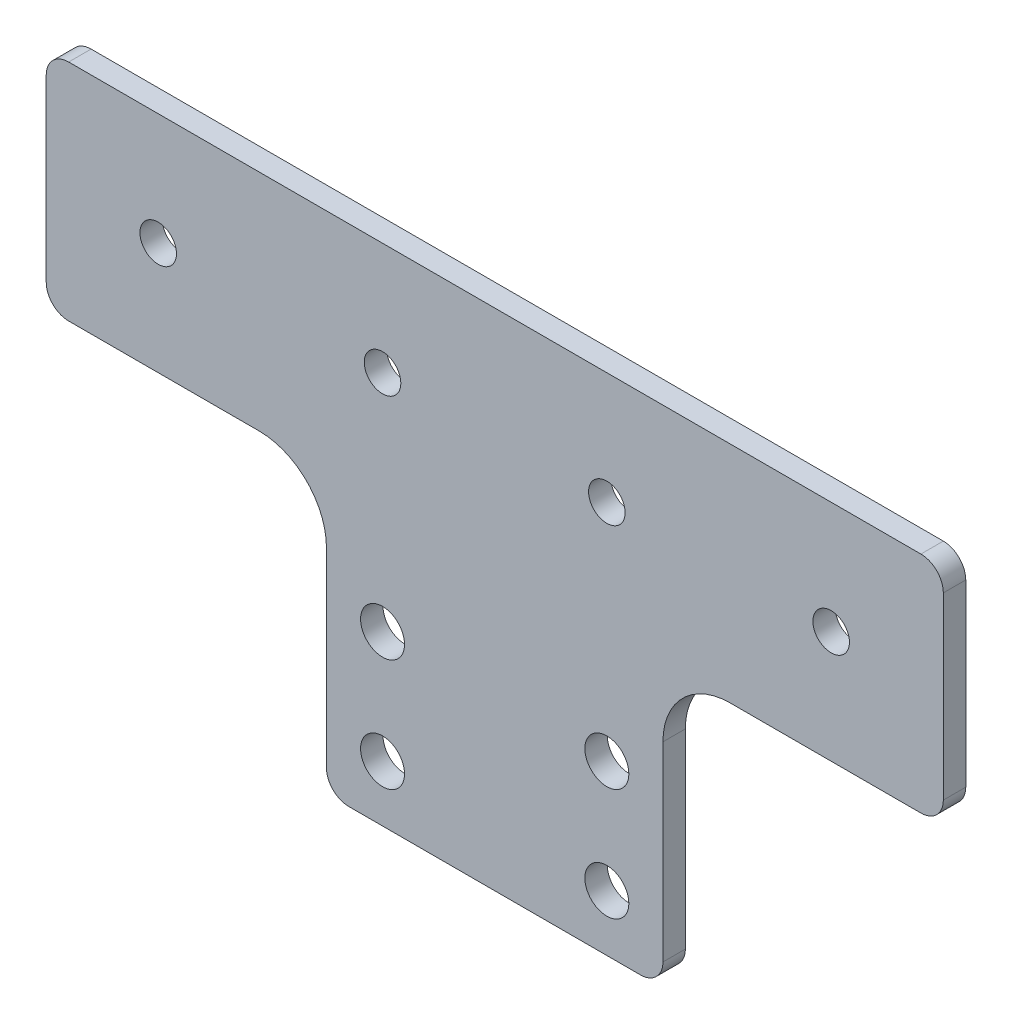
ISO-10303-21;
HEADER;
FILE_DESCRIPTION(('STEP AP214'),'2;1');
FILE_NAME('part.step','',(''),(''),'','','');
FILE_SCHEMA(('AUTOMOTIVE_DESIGN { 1 0 10303 214 1 1 1 1 }'));
ENDSEC;
DATA;
#1=APPLICATION_CONTEXT('core data for automotive mechanical design processes');
#2=APPLICATION_PROTOCOL_DEFINITION('international standard','automotive_design',2000,#1);
#3=PRODUCT_CONTEXT('',#1,'mechanical');
#4=PRODUCT('Part','Part','',(#3));
#5=PRODUCT_RELATED_PRODUCT_CATEGORY('part','',(#4));
#6=PRODUCT_DEFINITION_FORMATION('','',#4);
#7=PRODUCT_DEFINITION_CONTEXT('part definition',#1,'design');
#8=PRODUCT_DEFINITION('design','',#6,#7);
#9=PRODUCT_DEFINITION_SHAPE('','',#8);
#10=(LENGTH_UNIT() NAMED_UNIT(*) SI_UNIT(.MILLI.,.METRE.));
#11=(NAMED_UNIT(*) PLANE_ANGLE_UNIT() SI_UNIT($,.RADIAN.));
#12=(NAMED_UNIT(*) SI_UNIT($,.STERADIAN.) SOLID_ANGLE_UNIT());
#13=UNCERTAINTY_MEASURE_WITH_UNIT(LENGTH_MEASURE(1.E-05),#10,'distance_accuracy_value','');
#14=(GEOMETRIC_REPRESENTATION_CONTEXT(3) GLOBAL_UNCERTAINTY_ASSIGNED_CONTEXT((#13)) GLOBAL_UNIT_ASSIGNED_CONTEXT((#10,
#11,#12)) REPRESENTATION_CONTEXT('',''));
#15=CARTESIAN_POINT('',(0.,0.,0.));
#16=DIRECTION('',(0.,0.,1.));
#17=DIRECTION('',(1.,0.,0.));
#18=AXIS2_PLACEMENT_3D('',#15,#16,#17);
#19=CARTESIAN_POINT('',(29.21,-3.81,2.54));
#20=DIRECTION('',(0.,0.,1.));
#21=DIRECTION('',(1.,0.,0.));
#22=AXIS2_PLACEMENT_3D('',#19,#20,#21);
#23=PLANE('',#22);
#24=CARTESIAN_POINT('',(25.4,12.7000000000004,2.54));
#25=DIRECTION('',(0.,0.,1.));
#26=DIRECTION('',(1.,0.,0.));
#27=AXIS2_PLACEMENT_3D('',#24,#25,#26);
#28=CIRCLE('',#27,2.48920000000006);
#29=CARTESIAN_POINT('',(27.8892,12.7000000000004,2.54));
#30=VERTEX_POINT('',#29);
#31=EDGE_CURVE('E359',#30,#30,#28,.T.);
#32=ORIENTED_EDGE('',*,*,#31,.F.);
#33=EDGE_LOOP('',(#32));
#34=FACE_BOUND('',#33,.T.);
#35=CARTESIAN_POINT('',(0.,12.7,2.54));
#36=DIRECTION('',(0.,0.,1.));
#37=DIRECTION('',(1.,0.,0.));
#38=AXIS2_PLACEMENT_3D('',#35,#36,#37);
#39=CIRCLE('',#38,2.48920000000006);
#40=CARTESIAN_POINT('',(2.48920000000006,12.7,2.54));
#41=VERTEX_POINT('',#40);
#42=EDGE_CURVE('E371',#41,#41,#39,.T.);
#43=ORIENTED_EDGE('',*,*,#42,.F.);
#44=EDGE_LOOP('',(#43));
#45=FACE_BOUND('',#44,.T.);
#46=CARTESIAN_POINT('',(25.4,38.1000000000002,2.54));
#47=DIRECTION('',(0.,0.,1.));
#48=DIRECTION('',(1.,0.,0.));
#49=AXIS2_PLACEMENT_3D('',#46,#47,#48);
#50=CIRCLE('',#49,2.07010000000004);
#51=CARTESIAN_POINT('',(27.4701,38.1000000000002,2.54));
#52=VERTEX_POINT('',#51);
#53=EDGE_CURVE('E383',#52,#52,#50,.T.);
#54=ORIENTED_EDGE('',*,*,#53,.F.);
#55=EDGE_LOOP('',(#54));
#56=FACE_BOUND('',#55,.T.);
#57=CARTESIAN_POINT('',(-25.4,38.1000000000002,2.54));
#58=DIRECTION('',(0.,0.,1.));
#59=DIRECTION('',(1.,0.,0.));
#60=AXIS2_PLACEMENT_3D('',#57,#58,#59);
#61=CIRCLE('',#60,2.07010000000004);
#62=CARTESIAN_POINT('',(-23.3299,38.1000000000002,2.54));
#63=VERTEX_POINT('',#62);
#64=EDGE_CURVE('E182',#63,#63,#61,.T.);
#65=ORIENTED_EDGE('',*,*,#64,.F.);
#66=EDGE_LOOP('',(#65));
#67=FACE_BOUND('',#66,.T.);
#68=CARTESIAN_POINT('',(29.21,-3.81,2.54));
#69=DIRECTION('',(0.,0.,1.));
#70=DIRECTION('',(1.,0.,0.));
#71=AXIS2_PLACEMENT_3D('',#68,#69,#70);
#72=CIRCLE('',#71,2.54);
#73=CARTESIAN_POINT('',(29.21,-6.35,2.54));
#74=VERTEX_POINT('',#73);
#75=CARTESIAN_POINT('',(31.75,-3.81,2.54));
#76=VERTEX_POINT('',#75);
#77=EDGE_CURVE('E209',#74,#76,#72,.T.);
#78=ORIENTED_EDGE('',*,*,#77,.T.);
#79=DIRECTION('',(0.,1.,0.));
#80=VECTOR('',#79,1.);
#81=CARTESIAN_POINT('',(31.75,17.7800000000002,2.54));
#82=LINE('',#81,#80);
#83=CARTESIAN_POINT('',(31.75,17.7800000000002,2.54));
#84=VERTEX_POINT('',#83);
#85=EDGE_CURVE('E117',#76,#84,#82,.T.);
#86=ORIENTED_EDGE('',*,*,#85,.T.);
#87=CARTESIAN_POINT('',(39.37,17.7800000000002,2.54));
#88=DIRECTION('',(0.,0.,-1.));
#89=DIRECTION('',(1.,0.,0.));
#90=AXIS2_PLACEMENT_3D('',#87,#88,#89);
#91=CIRCLE('',#90,7.62);
#92=CARTESIAN_POINT('',(39.37,25.4000000000002,2.54));
#93=VERTEX_POINT('',#92);
#94=EDGE_CURVE('E248',#84,#93,#91,.T.);
#95=ORIENTED_EDGE('',*,*,#94,.T.);
#96=DIRECTION('',(1.,0.,0.));
#97=VECTOR('',#96,1.);
#98=CARTESIAN_POINT('',(39.37,25.4000000000002,2.54));
#99=LINE('',#98,#97);
#100=CARTESIAN_POINT('',(60.96,25.4000000000002,2.54));
#101=VERTEX_POINT('',#100);
#102=EDGE_CURVE('E267',#93,#101,#99,.T.);
#103=ORIENTED_EDGE('',*,*,#102,.T.);
#104=CARTESIAN_POINT('',(60.96,27.9400000000002,2.54));
#105=DIRECTION('',(0.,0.,1.));
#106=DIRECTION('',(1.,0.,0.));
#107=AXIS2_PLACEMENT_3D('',#104,#105,#106);
#108=CIRCLE('',#107,2.54);
#109=CARTESIAN_POINT('',(63.5,27.9400000000002,2.54));
#110=VERTEX_POINT('',#109);
#111=EDGE_CURVE('E264',#101,#110,#108,.T.);
#112=ORIENTED_EDGE('',*,*,#111,.T.);
#113=DIRECTION('',(0.,1.,0.));
#114=VECTOR('',#113,1.);
#115=CARTESIAN_POINT('',(63.5,48.2600000000002,2.54));
#116=LINE('',#115,#114);
#117=CARTESIAN_POINT('',(63.5,48.2600000000002,2.54));
#118=VERTEX_POINT('',#117);
#119=EDGE_CURVE('E266',#110,#118,#116,.T.);
#120=ORIENTED_EDGE('',*,*,#119,.T.);
#121=CARTESIAN_POINT('',(60.96,48.2600000000002,2.54));
#122=DIRECTION('',(0.,0.,1.));
#123=DIRECTION('',(-1.,0.,0.));
#124=AXIS2_PLACEMENT_3D('',#121,#122,#123);
#125=CIRCLE('',#124,2.54000000000001);
#126=CARTESIAN_POINT('',(60.96,50.8000000000002,2.54));
#127=VERTEX_POINT('',#126);
#128=EDGE_CURVE('E269',#118,#127,#125,.T.);
#129=ORIENTED_EDGE('',*,*,#128,.T.);
#130=DIRECTION('',(-1.,0.,0.));
#131=VECTOR('',#130,1.);
#132=CARTESIAN_POINT('',(-35.5394546240375,50.8000000000002,2.54));
#133=LINE('',#132,#131);
#134=CARTESIAN_POINT('',(-35.5394546240375,50.8000000000002,2.54));
#135=VERTEX_POINT('',#134);
#136=EDGE_CURVE('E275',#127,#135,#133,.T.);
#137=ORIENTED_EDGE('',*,*,#136,.T.);
#138=CARTESIAN_POINT('',(-35.5394546240375,48.2600000000002,2.54));
#139=DIRECTION('',(0.,0.,1.));
#140=DIRECTION('',(1.,0.,0.));
#141=AXIS2_PLACEMENT_3D('',#138,#139,#140);
#142=CIRCLE('',#141,2.53999999999999);
#143=CARTESIAN_POINT('',(-38.0794546240375,48.2600000000002,2.54));
#144=VERTEX_POINT('',#143);
#145=EDGE_CURVE('E277',#135,#144,#142,.T.);
#146=ORIENTED_EDGE('',*,*,#145,.T.);
#147=DIRECTION('',(0.,-1.,0.));
#148=VECTOR('',#147,1.);
#149=CARTESIAN_POINT('',(-38.0794546240375,48.2600000000002,2.54));
#150=LINE('',#149,#148);
#151=CARTESIAN_POINT('',(-38.0794546240375,27.9400000000002,2.54));
#152=VERTEX_POINT('',#151);
#153=EDGE_CURVE('E279',#144,#152,#150,.T.);
#154=ORIENTED_EDGE('',*,*,#153,.T.);
#155=CARTESIAN_POINT('',(-35.5394546240375,27.9400000000002,2.54));
#156=DIRECTION('',(0.,0.,1.));
#157=DIRECTION('',(1.,0.,0.));
#158=AXIS2_PLACEMENT_3D('',#155,#156,#157);
#159=CIRCLE('',#158,2.54);
#160=CARTESIAN_POINT('',(-35.5394546240375,25.4000000000002,2.54));
#161=VERTEX_POINT('',#160);
#162=EDGE_CURVE('E281',#152,#161,#159,.T.);
#163=ORIENTED_EDGE('',*,*,#162,.T.);
#164=DIRECTION('',(1.,0.,0.));
#165=VECTOR('',#164,1.);
#166=CARTESIAN_POINT('',(-35.5394546240375,25.4000000000002,2.54));
#167=LINE('',#166,#165);
#168=CARTESIAN_POINT('',(-13.97,25.4000000000002,2.54));
#169=VERTEX_POINT('',#168);
#170=EDGE_CURVE('E283',#161,#169,#167,.T.);
#171=ORIENTED_EDGE('',*,*,#170,.T.);
#172=CARTESIAN_POINT('',(-13.97,17.7800000000002,2.54));
#173=DIRECTION('',(0.,0.,-1.));
#174=DIRECTION('',(-1.,0.,0.));
#175=AXIS2_PLACEMENT_3D('',#172,#173,#174);
#176=CIRCLE('',#175,7.62);
#177=CARTESIAN_POINT('',(-6.35,17.7800000000002,2.54));
#178=VERTEX_POINT('',#177);
#179=EDGE_CURVE('E160',#169,#178,#176,.T.);
#180=ORIENTED_EDGE('',*,*,#179,.T.);
#181=DIRECTION('',(0.,-1.,0.));
#182=VECTOR('',#181,1.);
#183=CARTESIAN_POINT('',(-6.35,17.7800000000002,2.54));
#184=LINE('',#183,#182);
#185=CARTESIAN_POINT('',(-6.35,-3.81,2.54));
#186=VERTEX_POINT('',#185);
#187=EDGE_CURVE('E154',#178,#186,#184,.T.);
#188=ORIENTED_EDGE('',*,*,#187,.T.);
#189=CARTESIAN_POINT('',(-3.81,-3.81,2.54));
#190=DIRECTION('',(0.,0.,1.));
#191=DIRECTION('',(1.,0.,0.));
#192=AXIS2_PLACEMENT_3D('',#189,#190,#191);
#193=CIRCLE('',#192,2.54);
#194=CARTESIAN_POINT('',(-3.81,-6.35,2.54));
#195=VERTEX_POINT('',#194);
#196=EDGE_CURVE('E158',#186,#195,#193,.T.);
#197=ORIENTED_EDGE('',*,*,#196,.T.);
#198=DIRECTION('',(1.,0.,0.));
#199=VECTOR('',#198,1.);
#200=CARTESIAN_POINT('',(-3.81,-6.35,2.54));
#201=LINE('',#200,#199);
#202=EDGE_CURVE('E50',#195,#74,#201,.T.);
#203=ORIENTED_EDGE('',*,*,#202,.T.);
#204=EDGE_LOOP('',(#78,#86,#95,#103,#112,#120,#129,#137,#146,#154,#163,#171,#180,#188,#197,#203));
#205=FACE_BOUND('',#204,.T.);
#206=CARTESIAN_POINT('',(0.,38.1000000000002,2.54));
#207=DIRECTION('',(0.,0.,1.));
#208=DIRECTION('',(1.,0.,0.));
#209=AXIS2_PLACEMENT_3D('',#206,#207,#208);
#210=CIRCLE('',#209,2.07010000000004);
#211=CARTESIAN_POINT('',(2.07010000000004,38.1000000000002,2.54));
#212=VERTEX_POINT('',#211);
#213=EDGE_CURVE('E389',#212,#212,#210,.T.);
#214=ORIENTED_EDGE('',*,*,#213,.F.);
#215=EDGE_LOOP('',(#214));
#216=FACE_BOUND('',#215,.T.);
#217=CARTESIAN_POINT('',(50.8,38.1000000000002,2.54));
#218=DIRECTION('',(0.,0.,1.));
#219=DIRECTION('',(1.,0.,0.));
#220=AXIS2_PLACEMENT_3D('',#217,#218,#219);
#221=CIRCLE('',#220,2.07010000000004);
#222=CARTESIAN_POINT('',(52.8701,38.1000000000002,2.54));
#223=VERTEX_POINT('',#222);
#224=EDGE_CURVE('E377',#223,#223,#221,.T.);
#225=ORIENTED_EDGE('',*,*,#224,.F.);
#226=EDGE_LOOP('',(#225));
#227=FACE_BOUND('',#226,.T.);
#228=CARTESIAN_POINT('',(0.,0.,2.54));
#229=DIRECTION('',(0.,0.,1.));
#230=DIRECTION('',(1.,0.,0.));
#231=AXIS2_PLACEMENT_3D('',#228,#229,#230);
#232=CIRCLE('',#231,2.48919999999995);
#233=CARTESIAN_POINT('',(2.48919999999994,0.,2.54));
#234=VERTEX_POINT('',#233);
#235=EDGE_CURVE('E365',#234,#234,#232,.T.);
#236=ORIENTED_EDGE('',*,*,#235,.F.);
#237=EDGE_LOOP('',(#236));
#238=FACE_BOUND('',#237,.T.);
#239=CARTESIAN_POINT('',(25.4,4.30211422042248E-13,2.54));
#240=DIRECTION('',(0.,0.,1.));
#241=DIRECTION('',(1.,0.,0.));
#242=AXIS2_PLACEMENT_3D('',#239,#240,#241);
#243=CIRCLE('',#242,2.48920000000006);
#244=CARTESIAN_POINT('',(27.8892,4.30211422042248E-13,2.54));
#245=VERTEX_POINT('',#244);
#246=EDGE_CURVE('E350',#245,#245,#243,.T.);
#247=ORIENTED_EDGE('',*,*,#246,.F.);
#248=EDGE_LOOP('',(#247));
#249=FACE_BOUND('',#248,.T.);
#250=ADVANCED_FACE('F33',(#34,#45,#56,#67,#205,#216,#227,#238,#249),#23,.T.);
#251=CARTESIAN_POINT('',(29.21,-3.81,0.));
#252=DIRECTION('',(0.,0.,1.));
#253=DIRECTION('',(1.,0.,0.));
#254=AXIS2_PLACEMENT_3D('',#251,#252,#253);
#255=PLANE('',#254);
#256=CARTESIAN_POINT('',(29.21,-3.81,0.));
#257=DIRECTION('',(0.,0.,1.));
#258=DIRECTION('',(1.,0.,0.));
#259=AXIS2_PLACEMENT_3D('',#256,#257,#258);
#260=CIRCLE('',#259,2.54);
#261=CARTESIAN_POINT('',(29.21,-6.35,0.));
#262=VERTEX_POINT('',#261);
#263=CARTESIAN_POINT('',(31.75,-3.81,0.));
#264=VERTEX_POINT('',#263);
#265=EDGE_CURVE('E178',#262,#264,#260,.T.);
#266=ORIENTED_EDGE('',*,*,#265,.F.);
#267=DIRECTION('',(1.,0.,0.));
#268=VECTOR('',#267,1.);
#269=CARTESIAN_POINT('',(-3.81,-6.35,0.));
#270=LINE('',#269,#268);
#271=CARTESIAN_POINT('',(-3.81,-6.35,0.));
#272=VERTEX_POINT('',#271);
#273=EDGE_CURVE('E109',#272,#262,#270,.T.);
#274=ORIENTED_EDGE('',*,*,#273,.F.);
#275=CARTESIAN_POINT('',(-3.81,-3.81,0.));
#276=DIRECTION('',(0.,0.,1.));
#277=DIRECTION('',(1.,0.,0.));
#278=AXIS2_PLACEMENT_3D('',#275,#276,#277);
#279=CIRCLE('',#278,2.54);
#280=CARTESIAN_POINT('',(-6.35,-3.81,0.));
#281=VERTEX_POINT('',#280);
#282=EDGE_CURVE('E103',#281,#272,#279,.T.);
#283=ORIENTED_EDGE('',*,*,#282,.F.);
#284=DIRECTION('',(0.,-1.,0.));
#285=VECTOR('',#284,1.);
#286=CARTESIAN_POINT('',(-6.35,17.7800000000002,0.));
#287=LINE('',#286,#285);
#288=CARTESIAN_POINT('',(-6.35,17.7800000000002,0.));
#289=VERTEX_POINT('',#288);
#290=EDGE_CURVE('E168',#289,#281,#287,.T.);
#291=ORIENTED_EDGE('',*,*,#290,.F.);
#292=CARTESIAN_POINT('',(-13.97,17.7800000000002,0.));
#293=DIRECTION('',(0.,0.,-1.));
#294=DIRECTION('',(-1.,0.,0.));
#295=AXIS2_PLACEMENT_3D('',#292,#293,#294);
#296=CIRCLE('',#295,7.62);
#297=CARTESIAN_POINT('',(-13.97,25.4000000000002,0.));
#298=VERTEX_POINT('',#297);
#299=EDGE_CURVE('E204',#298,#289,#296,.T.);
#300=ORIENTED_EDGE('',*,*,#299,.F.);
#301=DIRECTION('',(1.,0.,0.));
#302=VECTOR('',#301,1.);
#303=CARTESIAN_POINT('',(-35.5394546240375,25.4000000000002,0.));
#304=LINE('',#303,#302);
#305=CARTESIAN_POINT('',(-35.5394546240375,25.4000000000002,0.));
#306=VERTEX_POINT('',#305);
#307=EDGE_CURVE('E202',#306,#298,#304,.T.);
#308=ORIENTED_EDGE('',*,*,#307,.F.);
#309=CARTESIAN_POINT('',(-35.5394546240375,27.9400000000002,0.));
#310=DIRECTION('',(0.,0.,1.));
#311=DIRECTION('',(1.,0.,0.));
#312=AXIS2_PLACEMENT_3D('',#309,#310,#311);
#313=CIRCLE('',#312,2.54);
#314=CARTESIAN_POINT('',(-38.0794546240375,27.9400000000002,0.));
#315=VERTEX_POINT('',#314);
#316=EDGE_CURVE('E200',#315,#306,#313,.T.);
#317=ORIENTED_EDGE('',*,*,#316,.F.);
#318=DIRECTION('',(0.,-1.,0.));
#319=VECTOR('',#318,1.);
#320=CARTESIAN_POINT('',(-38.0794546240375,48.2600000000002,0.));
#321=LINE('',#320,#319);
#322=CARTESIAN_POINT('',(-38.0794546240375,48.2600000000002,0.));
#323=VERTEX_POINT('',#322);
#324=EDGE_CURVE('E198',#323,#315,#321,.T.);
#325=ORIENTED_EDGE('',*,*,#324,.F.);
#326=CARTESIAN_POINT('',(-35.5394546240375,48.2600000000002,0.));
#327=DIRECTION('',(0.,0.,1.));
#328=DIRECTION('',(1.,0.,0.));
#329=AXIS2_PLACEMENT_3D('',#326,#327,#328);
#330=CIRCLE('',#329,2.53999999999999);
#331=CARTESIAN_POINT('',(-35.5394546240375,50.8000000000002,0.));
#332=VERTEX_POINT('',#331);
#333=EDGE_CURVE('E196',#332,#323,#330,.T.);
#334=ORIENTED_EDGE('',*,*,#333,.F.);
#335=DIRECTION('',(-1.,0.,0.));
#336=VECTOR('',#335,1.);
#337=CARTESIAN_POINT('',(-35.5394546240375,50.8000000000002,0.));
#338=LINE('',#337,#336);
#339=CARTESIAN_POINT('',(60.96,50.8000000000002,0.));
#340=VERTEX_POINT('',#339);
#341=EDGE_CURVE('E194',#340,#332,#338,.T.);
#342=ORIENTED_EDGE('',*,*,#341,.F.);
#343=CARTESIAN_POINT('',(60.96,48.2600000000002,0.));
#344=DIRECTION('',(0.,0.,1.));
#345=DIRECTION('',(-1.,0.,0.));
#346=AXIS2_PLACEMENT_3D('',#343,#344,#345);
#347=CIRCLE('',#346,2.54000000000001);
#348=CARTESIAN_POINT('',(63.5,48.2600000000002,0.));
#349=VERTEX_POINT('',#348);
#350=EDGE_CURVE('E192',#349,#340,#347,.T.);
#351=ORIENTED_EDGE('',*,*,#350,.F.);
#352=DIRECTION('',(0.,1.,0.));
#353=VECTOR('',#352,1.);
#354=CARTESIAN_POINT('',(63.5,48.2600000000002,0.));
#355=LINE('',#354,#353);
#356=CARTESIAN_POINT('',(63.5,27.9400000000002,0.));
#357=VERTEX_POINT('',#356);
#358=EDGE_CURVE('E190',#357,#349,#355,.T.);
#359=ORIENTED_EDGE('',*,*,#358,.F.);
#360=CARTESIAN_POINT('',(60.96,27.9400000000002,0.));
#361=DIRECTION('',(0.,0.,1.));
#362=DIRECTION('',(1.,0.,0.));
#363=AXIS2_PLACEMENT_3D('',#360,#361,#362);
#364=CIRCLE('',#363,2.54);
#365=CARTESIAN_POINT('',(60.96,25.4000000000002,0.));
#366=VERTEX_POINT('',#365);
#367=EDGE_CURVE('E188',#366,#357,#364,.T.);
#368=ORIENTED_EDGE('',*,*,#367,.F.);
#369=DIRECTION('',(1.,0.,0.));
#370=VECTOR('',#369,1.);
#371=CARTESIAN_POINT('',(39.37,25.4000000000002,0.));
#372=LINE('',#371,#370);
#373=CARTESIAN_POINT('',(39.37,25.4000000000002,0.));
#374=VERTEX_POINT('',#373);
#375=EDGE_CURVE('E186',#374,#366,#372,.T.);
#376=ORIENTED_EDGE('',*,*,#375,.F.);
#377=CARTESIAN_POINT('',(39.37,17.7800000000002,0.));
#378=DIRECTION('',(0.,0.,-1.));
#379=DIRECTION('',(1.,0.,0.));
#380=AXIS2_PLACEMENT_3D('',#377,#378,#379);
#381=CIRCLE('',#380,7.62);
#382=CARTESIAN_POINT('',(31.75,17.7800000000002,0.));
#383=VERTEX_POINT('',#382);
#384=EDGE_CURVE('E184',#383,#374,#381,.T.);
#385=ORIENTED_EDGE('',*,*,#384,.F.);
#386=DIRECTION('',(0.,1.,0.));
#387=VECTOR('',#386,1.);
#388=CARTESIAN_POINT('',(31.75,17.7800000000002,0.));
#389=LINE('',#388,#387);
#390=EDGE_CURVE('E181',#264,#383,#389,.T.);
#391=ORIENTED_EDGE('',*,*,#390,.F.);
#392=EDGE_LOOP('',(#266,#274,#283,#291,#300,#308,#317,#325,#334,#342,#351,#359,#368,#376,#385,#391));
#393=FACE_BOUND('',#392,.T.);
#394=CARTESIAN_POINT('',(-25.4,38.1000000000002,0.));
#395=DIRECTION('',(0.,0.,1.));
#396=DIRECTION('',(1.,0.,0.));
#397=AXIS2_PLACEMENT_3D('',#394,#395,#396);
#398=CIRCLE('',#397,2.07010000000004);
#399=CARTESIAN_POINT('',(-23.3299,38.1000000000002,0.));
#400=VERTEX_POINT('',#399);
#401=EDGE_CURVE('E392',#400,#400,#398,.T.);
#402=ORIENTED_EDGE('',*,*,#401,.T.);
#403=EDGE_LOOP('',(#402));
#404=FACE_BOUND('',#403,.T.);
#405=CARTESIAN_POINT('',(0.,38.1000000000002,0.));
#406=DIRECTION('',(0.,0.,1.));
#407=DIRECTION('',(1.,0.,0.));
#408=AXIS2_PLACEMENT_3D('',#405,#406,#407);
#409=CIRCLE('',#408,2.07010000000004);
#410=CARTESIAN_POINT('',(2.07010000000004,38.1000000000002,0.));
#411=VERTEX_POINT('',#410);
#412=EDGE_CURVE('E386',#411,#411,#409,.T.);
#413=ORIENTED_EDGE('',*,*,#412,.T.);
#414=EDGE_LOOP('',(#413));
#415=FACE_BOUND('',#414,.T.);
#416=CARTESIAN_POINT('',(25.4,38.1000000000002,0.));
#417=DIRECTION('',(0.,0.,1.));
#418=DIRECTION('',(1.,0.,0.));
#419=AXIS2_PLACEMENT_3D('',#416,#417,#418);
#420=CIRCLE('',#419,2.07010000000004);
#421=CARTESIAN_POINT('',(27.4701,38.1000000000002,0.));
#422=VERTEX_POINT('',#421);
#423=EDGE_CURVE('E380',#422,#422,#420,.T.);
#424=ORIENTED_EDGE('',*,*,#423,.T.);
#425=EDGE_LOOP('',(#424));
#426=FACE_BOUND('',#425,.T.);
#427=CARTESIAN_POINT('',(50.8,38.1000000000002,0.));
#428=DIRECTION('',(0.,0.,1.));
#429=DIRECTION('',(1.,0.,0.));
#430=AXIS2_PLACEMENT_3D('',#427,#428,#429);
#431=CIRCLE('',#430,2.07010000000004);
#432=CARTESIAN_POINT('',(52.8701,38.1000000000002,0.));
#433=VERTEX_POINT('',#432);
#434=EDGE_CURVE('E374',#433,#433,#431,.T.);
#435=ORIENTED_EDGE('',*,*,#434,.T.);
#436=EDGE_LOOP('',(#435));
#437=FACE_BOUND('',#436,.T.);
#438=CARTESIAN_POINT('',(0.,12.7,0.));
#439=DIRECTION('',(0.,0.,1.));
#440=DIRECTION('',(1.,0.,0.));
#441=AXIS2_PLACEMENT_3D('',#438,#439,#440);
#442=CIRCLE('',#441,2.48920000000006);
#443=CARTESIAN_POINT('',(2.48920000000006,12.7,0.));
#444=VERTEX_POINT('',#443);
#445=EDGE_CURVE('E368',#444,#444,#442,.T.);
#446=ORIENTED_EDGE('',*,*,#445,.T.);
#447=EDGE_LOOP('',(#446));
#448=FACE_BOUND('',#447,.T.);
#449=CARTESIAN_POINT('',(0.,0.,0.));
#450=DIRECTION('',(0.,0.,1.));
#451=DIRECTION('',(1.,0.,0.));
#452=AXIS2_PLACEMENT_3D('',#449,#450,#451);
#453=CIRCLE('',#452,2.48919999999995);
#454=CARTESIAN_POINT('',(2.48919999999994,0.,0.));
#455=VERTEX_POINT('',#454);
#456=EDGE_CURVE('E362',#455,#455,#453,.T.);
#457=ORIENTED_EDGE('',*,*,#456,.T.);
#458=EDGE_LOOP('',(#457));
#459=FACE_BOUND('',#458,.T.);
#460=CARTESIAN_POINT('',(25.4,12.7000000000004,0.));
#461=DIRECTION('',(0.,0.,1.));
#462=DIRECTION('',(1.,0.,0.));
#463=AXIS2_PLACEMENT_3D('',#460,#461,#462);
#464=CIRCLE('',#463,2.48920000000006);
#465=CARTESIAN_POINT('',(27.8892,12.7000000000004,0.));
#466=VERTEX_POINT('',#465);
#467=EDGE_CURVE('E356',#466,#466,#464,.T.);
#468=ORIENTED_EDGE('',*,*,#467,.T.);
#469=EDGE_LOOP('',(#468));
#470=FACE_BOUND('',#469,.T.);
#471=CARTESIAN_POINT('',(25.4,4.30211422042248E-13,0.));
#472=DIRECTION('',(0.,0.,1.));
#473=DIRECTION('',(1.,0.,0.));
#474=AXIS2_PLACEMENT_3D('',#471,#472,#473);
#475=CIRCLE('',#474,2.48920000000006);
#476=CARTESIAN_POINT('',(27.8892,4.30211422042248E-13,0.));
#477=VERTEX_POINT('',#476);
#478=EDGE_CURVE('E353',#477,#477,#475,.T.);
#479=ORIENTED_EDGE('',*,*,#478,.T.);
#480=EDGE_LOOP('',(#479));
#481=FACE_BOUND('',#480,.T.);
#482=ADVANCED_FACE('F252',(#393,#404,#415,#426,#437,#448,#459,#470,#481),#255,.F.);
#483=CARTESIAN_POINT('',(29.21,-3.81,2.54));
#484=DIRECTION('',(0.,0.,-1.));
#485=DIRECTION('',(-1.,0.,0.));
#486=AXIS2_PLACEMENT_3D('',#483,#484,#485);
#487=CYLINDRICAL_SURFACE('',#486,2.54);
#488=ORIENTED_EDGE('',*,*,#265,.T.);
#489=DIRECTION('',(0.,0.,-1.));
#490=VECTOR('',#489,1.);
#491=CARTESIAN_POINT('',(31.75,-3.81,2.54));
#492=LINE('',#491,#490);
#493=EDGE_CURVE('E11',#76,#264,#492,.T.);
#494=ORIENTED_EDGE('',*,*,#493,.F.);
#495=ORIENTED_EDGE('',*,*,#77,.F.);
#496=DIRECTION('',(0.,0.,-1.));
#497=VECTOR('',#496,1.);
#498=CARTESIAN_POINT('',(29.21,-6.35,2.54));
#499=LINE('',#498,#497);
#500=EDGE_CURVE('E174',#74,#262,#499,.T.);
#501=ORIENTED_EDGE('',*,*,#500,.T.);
#502=EDGE_LOOP('',(#488,#494,#495,#501));
#503=FACE_BOUND('',#502,.T.);
#504=ADVANCED_FACE('F35',(#503),#487,.T.);
#505=CARTESIAN_POINT('',(31.75,17.7800000000002,2.54));
#506=DIRECTION('',(-1.,0.,0.));
#507=DIRECTION('',(0.,0.,1.));
#508=AXIS2_PLACEMENT_3D('',#505,#506,#507);
#509=PLANE('',#508);
#510=ORIENTED_EDGE('',*,*,#390,.T.);
#511=DIRECTION('',(0.,0.,-1.));
#512=VECTOR('',#511,1.);
#513=CARTESIAN_POINT('',(31.75,17.7800000000002,2.54));
#514=LINE('',#513,#512);
#515=EDGE_CURVE('E42',#84,#383,#514,.T.);
#516=ORIENTED_EDGE('',*,*,#515,.F.);
#517=ORIENTED_EDGE('',*,*,#85,.F.);
#518=ORIENTED_EDGE('',*,*,#493,.T.);
#519=EDGE_LOOP('',(#510,#516,#517,#518));
#520=FACE_BOUND('',#519,.T.);
#521=ADVANCED_FACE('F578',(#520),#509,.F.);
#522=CARTESIAN_POINT('',(39.37,17.7800000000002,2.54));
#523=DIRECTION('',(0.,0.,-1.));
#524=DIRECTION('',(-1.,0.,0.));
#525=AXIS2_PLACEMENT_3D('',#522,#523,#524);
#526=CYLINDRICAL_SURFACE('',#525,7.62);
#527=ORIENTED_EDGE('',*,*,#384,.T.);
#528=DIRECTION('',(0.,0.,-1.));
#529=VECTOR('',#528,1.);
#530=CARTESIAN_POINT('',(39.37,25.4000000000002,2.54));
#531=LINE('',#530,#529);
#532=EDGE_CURVE('E240',#93,#374,#531,.T.);
#533=ORIENTED_EDGE('',*,*,#532,.F.);
#534=ORIENTED_EDGE('',*,*,#94,.F.);
#535=ORIENTED_EDGE('',*,*,#515,.T.);
#536=EDGE_LOOP('',(#527,#533,#534,#535));
#537=FACE_BOUND('',#536,.T.);
#538=ADVANCED_FACE('F246',(#537),#526,.F.);
#539=CARTESIAN_POINT('',(39.37,25.4000000000002,2.54));
#540=DIRECTION('',(0.,1.,0.));
#541=DIRECTION('',(0.,0.,1.));
#542=AXIS2_PLACEMENT_3D('',#539,#540,#541);
#543=PLANE('',#542);
#544=ORIENTED_EDGE('',*,*,#375,.T.);
#545=DIRECTION('',(0.,0.,-1.));
#546=VECTOR('',#545,1.);
#547=CARTESIAN_POINT('',(60.96,25.4000000000002,2.54));
#548=LINE('',#547,#546);
#549=EDGE_CURVE('E237',#101,#366,#548,.T.);
#550=ORIENTED_EDGE('',*,*,#549,.F.);
#551=ORIENTED_EDGE('',*,*,#102,.F.);
#552=ORIENTED_EDGE('',*,*,#532,.T.);
#553=EDGE_LOOP('',(#544,#550,#551,#552));
#554=FACE_BOUND('',#553,.T.);
#555=ADVANCED_FACE('F258',(#554),#543,.F.);
#556=CARTESIAN_POINT('',(60.96,27.9400000000002,2.54));
#557=DIRECTION('',(0.,0.,-1.));
#558=DIRECTION('',(-1.,0.,0.));
#559=AXIS2_PLACEMENT_3D('',#556,#557,#558);
#560=CYLINDRICAL_SURFACE('',#559,2.54);
#561=ORIENTED_EDGE('',*,*,#367,.T.);
#562=DIRECTION('',(0.,0.,-1.));
#563=VECTOR('',#562,1.);
#564=CARTESIAN_POINT('',(63.5,27.9400000000002,2.54));
#565=LINE('',#564,#563);
#566=EDGE_CURVE('E234',#110,#357,#565,.T.);
#567=ORIENTED_EDGE('',*,*,#566,.F.);
#568=ORIENTED_EDGE('',*,*,#111,.F.);
#569=ORIENTED_EDGE('',*,*,#549,.T.);
#570=EDGE_LOOP('',(#561,#567,#568,#569));
#571=FACE_BOUND('',#570,.T.);
#572=ADVANCED_FACE('F262',(#571),#560,.T.);
#573=CARTESIAN_POINT('',(63.5,48.2600000000002,2.54));
#574=DIRECTION('',(-1.,0.,0.));
#575=DIRECTION('',(0.,-1.,0.));
#576=AXIS2_PLACEMENT_3D('',#573,#574,#575);
#577=PLANE('',#576);
#578=ORIENTED_EDGE('',*,*,#358,.T.);
#579=DIRECTION('',(0.,0.,-1.));
#580=VECTOR('',#579,1.);
#581=CARTESIAN_POINT('',(63.5,48.2600000000002,2.54));
#582=LINE('',#581,#580);
#583=EDGE_CURVE('E231',#118,#349,#582,.T.);
#584=ORIENTED_EDGE('',*,*,#583,.F.);
#585=ORIENTED_EDGE('',*,*,#119,.F.);
#586=ORIENTED_EDGE('',*,*,#566,.T.);
#587=EDGE_LOOP('',(#578,#584,#585,#586));
#588=FACE_BOUND('',#587,.T.);
#589=ADVANCED_FACE('F543',(#588),#577,.F.);
#590=CARTESIAN_POINT('',(60.96,48.2600000000002,2.54));
#591=DIRECTION('',(0.,0.,-1.));
#592=DIRECTION('',(-1.,0.,0.));
#593=AXIS2_PLACEMENT_3D('',#590,#591,#592);
#594=CYLINDRICAL_SURFACE('',#593,2.54000000000001);
#595=ORIENTED_EDGE('',*,*,#350,.T.);
#596=DIRECTION('',(0.,0.,-1.));
#597=VECTOR('',#596,1.);
#598=CARTESIAN_POINT('',(60.96,50.8000000000002,2.54));
#599=LINE('',#598,#597);
#600=EDGE_CURVE('E228',#127,#340,#599,.T.);
#601=ORIENTED_EDGE('',*,*,#600,.F.);
#602=ORIENTED_EDGE('',*,*,#128,.F.);
#603=ORIENTED_EDGE('',*,*,#583,.T.);
#604=EDGE_LOOP('',(#595,#601,#602,#603));
#605=FACE_BOUND('',#604,.T.);
#606=ADVANCED_FACE('F533',(#605),#594,.T.);
#607=CARTESIAN_POINT('',(-35.5394546240375,50.8000000000002,2.54));
#608=DIRECTION('',(0.,-1.,0.));
#609=DIRECTION('',(1.,0.,0.));
#610=AXIS2_PLACEMENT_3D('',#607,#608,#609);
#611=PLANE('',#610);
#612=ORIENTED_EDGE('',*,*,#341,.T.);
#613=DIRECTION('',(0.,0.,-1.));
#614=VECTOR('',#613,1.);
#615=CARTESIAN_POINT('',(-35.5394546240375,50.8000000000002,2.54));
#616=LINE('',#615,#614);
#617=EDGE_CURVE('E225',#135,#332,#616,.T.);
#618=ORIENTED_EDGE('',*,*,#617,.F.);
#619=ORIENTED_EDGE('',*,*,#136,.F.);
#620=ORIENTED_EDGE('',*,*,#600,.T.);
#621=EDGE_LOOP('',(#612,#618,#619,#620));
#622=FACE_BOUND('',#621,.T.);
#623=ADVANCED_FACE('F523',(#622),#611,.F.);
#624=CARTESIAN_POINT('',(-35.5394546240375,48.2600000000002,2.54));
#625=DIRECTION('',(0.,0.,-1.));
#626=DIRECTION('',(-1.,0.,0.));
#627=AXIS2_PLACEMENT_3D('',#624,#625,#626);
#628=CYLINDRICAL_SURFACE('',#627,2.53999999999999);
#629=ORIENTED_EDGE('',*,*,#333,.T.);
#630=DIRECTION('',(0.,0.,-1.));
#631=VECTOR('',#630,1.);
#632=CARTESIAN_POINT('',(-38.0794546240375,48.2600000000002,2.54));
#633=LINE('',#632,#631);
#634=EDGE_CURVE('E222',#144,#323,#633,.T.);
#635=ORIENTED_EDGE('',*,*,#634,.F.);
#636=ORIENTED_EDGE('',*,*,#145,.F.);
#637=ORIENTED_EDGE('',*,*,#617,.T.);
#638=EDGE_LOOP('',(#629,#635,#636,#637));
#639=FACE_BOUND('',#638,.T.);
#640=ADVANCED_FACE('F513',(#639),#628,.T.);
#641=CARTESIAN_POINT('',(-38.0794546240375,48.2600000000002,2.54));
#642=DIRECTION('',(1.,0.,0.));
#643=DIRECTION('',(0.,1.,0.));
#644=AXIS2_PLACEMENT_3D('',#641,#642,#643);
#645=PLANE('',#644);
#646=ORIENTED_EDGE('',*,*,#324,.T.);
#647=DIRECTION('',(0.,0.,-1.));
#648=VECTOR('',#647,1.);
#649=CARTESIAN_POINT('',(-38.0794546240375,27.9400000000002,2.54));
#650=LINE('',#649,#648);
#651=EDGE_CURVE('E219',#152,#315,#650,.T.);
#652=ORIENTED_EDGE('',*,*,#651,.F.);
#653=ORIENTED_EDGE('',*,*,#153,.F.);
#654=ORIENTED_EDGE('',*,*,#634,.T.);
#655=EDGE_LOOP('',(#646,#652,#653,#654));
#656=FACE_BOUND('',#655,.T.);
#657=ADVANCED_FACE('F503',(#656),#645,.F.);
#658=CARTESIAN_POINT('',(-35.5394546240375,27.9400000000002,2.54));
#659=DIRECTION('',(0.,0.,-1.));
#660=DIRECTION('',(-1.,0.,0.));
#661=AXIS2_PLACEMENT_3D('',#658,#659,#660);
#662=CYLINDRICAL_SURFACE('',#661,2.54);
#663=ORIENTED_EDGE('',*,*,#316,.T.);
#664=DIRECTION('',(0.,0.,-1.));
#665=VECTOR('',#664,1.);
#666=CARTESIAN_POINT('',(-35.5394546240375,25.4000000000002,2.54));
#667=LINE('',#666,#665);
#668=EDGE_CURVE('E216',#161,#306,#667,.T.);
#669=ORIENTED_EDGE('',*,*,#668,.F.);
#670=ORIENTED_EDGE('',*,*,#162,.F.);
#671=ORIENTED_EDGE('',*,*,#651,.T.);
#672=EDGE_LOOP('',(#663,#669,#670,#671));
#673=FACE_BOUND('',#672,.T.);
#674=ADVANCED_FACE('F494',(#673),#662,.T.);
#675=CARTESIAN_POINT('',(-35.5394546240375,25.4000000000002,2.54));
#676=DIRECTION('',(0.,1.,0.));
#677=DIRECTION('',(-1.,0.,0.));
#678=AXIS2_PLACEMENT_3D('',#675,#676,#677);
#679=PLANE('',#678);
#680=ORIENTED_EDGE('',*,*,#307,.T.);
#681=DIRECTION('',(0.,0.,-1.));
#682=VECTOR('',#681,1.);
#683=CARTESIAN_POINT('',(-13.97,25.4000000000002,2.54));
#684=LINE('',#683,#682);
#685=EDGE_CURVE('E213',#169,#298,#684,.T.);
#686=ORIENTED_EDGE('',*,*,#685,.F.);
#687=ORIENTED_EDGE('',*,*,#170,.F.);
#688=ORIENTED_EDGE('',*,*,#668,.T.);
#689=EDGE_LOOP('',(#680,#686,#687,#688));
#690=FACE_BOUND('',#689,.T.);
#691=ADVANCED_FACE('F289',(#690),#679,.F.);
#692=CARTESIAN_POINT('',(-13.97,17.7800000000002,2.54));
#693=DIRECTION('',(0.,0.,-1.));
#694=DIRECTION('',(-1.,0.,0.));
#695=AXIS2_PLACEMENT_3D('',#692,#693,#694);
#696=CYLINDRICAL_SURFACE('',#695,7.62);
#697=ORIENTED_EDGE('',*,*,#299,.T.);
#698=DIRECTION('',(0.,0.,-1.));
#699=VECTOR('',#698,1.);
#700=CARTESIAN_POINT('',(-6.35,17.7800000000002,2.54));
#701=LINE('',#700,#699);
#702=EDGE_CURVE('E169',#178,#289,#701,.T.);
#703=ORIENTED_EDGE('',*,*,#702,.F.);
#704=ORIENTED_EDGE('',*,*,#179,.F.);
#705=ORIENTED_EDGE('',*,*,#685,.T.);
#706=EDGE_LOOP('',(#697,#703,#704,#705));
#707=FACE_BOUND('',#706,.T.);
#708=ADVANCED_FACE('F293',(#707),#696,.F.);
#709=CARTESIAN_POINT('',(-6.35,17.7800000000002,2.54));
#710=DIRECTION('',(1.,0.,0.));
#711=DIRECTION('',(0.,1.,0.));
#712=AXIS2_PLACEMENT_3D('',#709,#710,#711);
#713=PLANE('',#712);
#714=ORIENTED_EDGE('',*,*,#290,.T.);
#715=DIRECTION('',(0.,0.,-1.));
#716=VECTOR('',#715,1.);
#717=CARTESIAN_POINT('',(-6.35,-3.81,2.54));
#718=LINE('',#717,#716);
#719=EDGE_CURVE('E165',#186,#281,#718,.T.);
#720=ORIENTED_EDGE('',*,*,#719,.F.);
#721=ORIENTED_EDGE('',*,*,#187,.F.);
#722=ORIENTED_EDGE('',*,*,#702,.T.);
#723=EDGE_LOOP('',(#714,#720,#721,#722));
#724=FACE_BOUND('',#723,.T.);
#725=ADVANCED_FACE('F166',(#724),#713,.F.);
#726=CARTESIAN_POINT('',(-3.81,-3.81,2.54));
#727=DIRECTION('',(0.,0.,-1.));
#728=DIRECTION('',(-1.,0.,0.));
#729=AXIS2_PLACEMENT_3D('',#726,#727,#728);
#730=CYLINDRICAL_SURFACE('',#729,2.54);
#731=ORIENTED_EDGE('',*,*,#282,.T.);
#732=DIRECTION('',(0.,0.,-1.));
#733=VECTOR('',#732,1.);
#734=CARTESIAN_POINT('',(-3.81,-6.35,2.54));
#735=LINE('',#734,#733);
#736=EDGE_CURVE('E170',#195,#272,#735,.T.);
#737=ORIENTED_EDGE('',*,*,#736,.F.);
#738=ORIENTED_EDGE('',*,*,#196,.F.);
#739=ORIENTED_EDGE('',*,*,#719,.T.);
#740=EDGE_LOOP('',(#731,#737,#738,#739));
#741=FACE_BOUND('',#740,.T.);
#742=ADVANCED_FACE('F172',(#741),#730,.T.);
#743=CARTESIAN_POINT('',(-3.81,-6.35,2.54));
#744=DIRECTION('',(0.,1.,0.));
#745=DIRECTION('',(0.,0.,1.));
#746=AXIS2_PLACEMENT_3D('',#743,#744,#745);
#747=PLANE('',#746);
#748=ORIENTED_EDGE('',*,*,#273,.T.);
#749=ORIENTED_EDGE('',*,*,#500,.F.);
#750=ORIENTED_EDGE('',*,*,#202,.F.);
#751=ORIENTED_EDGE('',*,*,#736,.T.);
#752=EDGE_LOOP('',(#748,#749,#750,#751));
#753=FACE_BOUND('',#752,.T.);
#754=ADVANCED_FACE('F297',(#753),#747,.F.);
#755=CARTESIAN_POINT('',(-25.4,38.1000000000002,2.54));
#756=DIRECTION('',(0.,0.,-1.));
#757=DIRECTION('',(-1.,0.,0.));
#758=AXIS2_PLACEMENT_3D('',#755,#756,#757);
#759=CYLINDRICAL_SURFACE('',#758,2.07010000000004);
#760=ORIENTED_EDGE('',*,*,#64,.T.);
#761=EDGE_LOOP('',(#760));
#762=FACE_BOUND('',#761,.T.);
#763=ORIENTED_EDGE('',*,*,#401,.F.);
#764=EDGE_LOOP('',(#763));
#765=FACE_BOUND('',#764,.T.);
#766=ADVANCED_FACE('F299',(#762,#765),#759,.F.);
#767=CARTESIAN_POINT('',(0.,38.1000000000002,2.54));
#768=DIRECTION('',(0.,0.,-1.));
#769=DIRECTION('',(-1.,0.,0.));
#770=AXIS2_PLACEMENT_3D('',#767,#768,#769);
#771=CYLINDRICAL_SURFACE('',#770,2.07010000000004);
#772=ORIENTED_EDGE('',*,*,#213,.T.);
#773=EDGE_LOOP('',(#772));
#774=FACE_BOUND('',#773,.T.);
#775=ORIENTED_EDGE('',*,*,#412,.F.);
#776=EDGE_LOOP('',(#775));
#777=FACE_BOUND('',#776,.T.);
#778=ADVANCED_FACE('F305',(#774,#777),#771,.F.);
#779=CARTESIAN_POINT('',(25.4,38.1000000000002,2.54));
#780=DIRECTION('',(0.,0.,-1.));
#781=DIRECTION('',(-1.,0.,0.));
#782=AXIS2_PLACEMENT_3D('',#779,#780,#781);
#783=CYLINDRICAL_SURFACE('',#782,2.07010000000004);
#784=ORIENTED_EDGE('',*,*,#53,.T.);
#785=EDGE_LOOP('',(#784));
#786=FACE_BOUND('',#785,.T.);
#787=ORIENTED_EDGE('',*,*,#423,.F.);
#788=EDGE_LOOP('',(#787));
#789=FACE_BOUND('',#788,.T.);
#790=ADVANCED_FACE('F321',(#786,#789),#783,.F.);
#791=CARTESIAN_POINT('',(50.8,38.1000000000002,2.54));
#792=DIRECTION('',(0.,0.,-1.));
#793=DIRECTION('',(-1.,0.,0.));
#794=AXIS2_PLACEMENT_3D('',#791,#792,#793);
#795=CYLINDRICAL_SURFACE('',#794,2.07010000000004);
#796=ORIENTED_EDGE('',*,*,#224,.T.);
#797=EDGE_LOOP('',(#796));
#798=FACE_BOUND('',#797,.T.);
#799=ORIENTED_EDGE('',*,*,#434,.F.);
#800=EDGE_LOOP('',(#799));
#801=FACE_BOUND('',#800,.T.);
#802=ADVANCED_FACE('F325',(#798,#801),#795,.F.);
#803=CARTESIAN_POINT('',(0.,12.7,2.54));
#804=DIRECTION('',(0.,0.,-1.));
#805=DIRECTION('',(-1.,0.,0.));
#806=AXIS2_PLACEMENT_3D('',#803,#804,#805);
#807=CYLINDRICAL_SURFACE('',#806,2.48920000000006);
#808=ORIENTED_EDGE('',*,*,#42,.T.);
#809=EDGE_LOOP('',(#808));
#810=FACE_BOUND('',#809,.T.);
#811=ORIENTED_EDGE('',*,*,#445,.F.);
#812=EDGE_LOOP('',(#811));
#813=FACE_BOUND('',#812,.T.);
#814=ADVANCED_FACE('F329',(#810,#813),#807,.F.);
#815=CARTESIAN_POINT('',(0.,0.,2.54));
#816=DIRECTION('',(0.,0.,-1.));
#817=DIRECTION('',(-1.,0.,0.));
#818=AXIS2_PLACEMENT_3D('',#815,#816,#817);
#819=CYLINDRICAL_SURFACE('',#818,2.48919999999995);
#820=ORIENTED_EDGE('',*,*,#235,.T.);
#821=EDGE_LOOP('',(#820));
#822=FACE_BOUND('',#821,.T.);
#823=ORIENTED_EDGE('',*,*,#456,.F.);
#824=EDGE_LOOP('',(#823));
#825=FACE_BOUND('',#824,.T.);
#826=ADVANCED_FACE('F333',(#822,#825),#819,.F.);
#827=CARTESIAN_POINT('',(25.4,12.7000000000004,2.54));
#828=DIRECTION('',(0.,0.,-1.));
#829=DIRECTION('',(-1.,0.,0.));
#830=AXIS2_PLACEMENT_3D('',#827,#828,#829);
#831=CYLINDRICAL_SURFACE('',#830,2.48920000000006);
#832=ORIENTED_EDGE('',*,*,#31,.T.);
#833=EDGE_LOOP('',(#832));
#834=FACE_BOUND('',#833,.T.);
#835=ORIENTED_EDGE('',*,*,#467,.F.);
#836=EDGE_LOOP('',(#835));
#837=FACE_BOUND('',#836,.T.);
#838=ADVANCED_FACE('F337',(#834,#837),#831,.F.);
#839=CARTESIAN_POINT('',(25.4,4.30211422042248E-13,2.54));
#840=DIRECTION('',(0.,0.,-1.));
#841=DIRECTION('',(-1.,0.,0.));
#842=AXIS2_PLACEMENT_3D('',#839,#840,#841);
#843=CYLINDRICAL_SURFACE('',#842,2.48920000000006);
#844=ORIENTED_EDGE('',*,*,#246,.T.);
#845=EDGE_LOOP('',(#844));
#846=FACE_BOUND('',#845,.T.);
#847=ORIENTED_EDGE('',*,*,#478,.F.);
#848=EDGE_LOOP('',(#847));
#849=FACE_BOUND('',#848,.T.);
#850=ADVANCED_FACE('F341',(#846,#849),#843,.F.);
#851=CLOSED_SHELL('',(#250,#482,#504,#521,#538,#555,#572,#589,#606,#623,#640,#657,#674,#691,
#708,#725,#742,#754,#766,#778,#790,#802,#814,#826,#838,#850));
#852=MANIFOLD_SOLID_BREP('B2',#851);
#853=ADVANCED_BREP_SHAPE_REPRESENTATION('',(#18,#852),#14);
#854=SHAPE_DEFINITION_REPRESENTATION(#9,#853);
ENDSEC;
END-ISO-10303-21;
